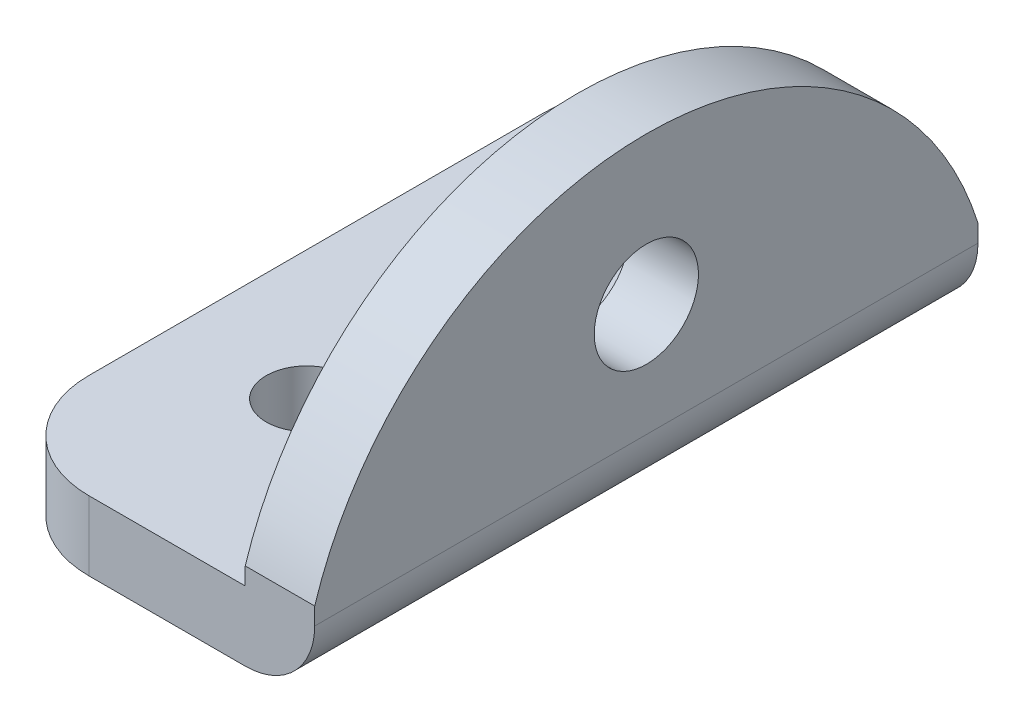
ISO-10303-21;
HEADER;
FILE_DESCRIPTION(('STEP AP214'),'2;1');
FILE_NAME('part.step','',(''),(''),'','','');
FILE_SCHEMA(('AUTOMOTIVE_DESIGN { 1 0 10303 214 1 1 1 1 }'));
ENDSEC;
DATA;
#1=APPLICATION_CONTEXT('core data for automotive mechanical design processes');
#2=APPLICATION_PROTOCOL_DEFINITION('international standard','automotive_design',2000,#1);
#3=PRODUCT_CONTEXT('',#1,'mechanical');
#4=PRODUCT('Part','Part','',(#3));
#5=PRODUCT_RELATED_PRODUCT_CATEGORY('part','',(#4));
#6=PRODUCT_DEFINITION_FORMATION('','',#4);
#7=PRODUCT_DEFINITION_CONTEXT('part definition',#1,'design');
#8=PRODUCT_DEFINITION('design','',#6,#7);
#9=PRODUCT_DEFINITION_SHAPE('','',#8);
#10=(LENGTH_UNIT() NAMED_UNIT(*) SI_UNIT(.MILLI.,.METRE.));
#11=(NAMED_UNIT(*) PLANE_ANGLE_UNIT() SI_UNIT($,.RADIAN.));
#12=(NAMED_UNIT(*) SI_UNIT($,.STERADIAN.) SOLID_ANGLE_UNIT());
#13=UNCERTAINTY_MEASURE_WITH_UNIT(LENGTH_MEASURE(1.E-05),#10,'distance_accuracy_value','');
#14=(GEOMETRIC_REPRESENTATION_CONTEXT(3) GLOBAL_UNCERTAINTY_ASSIGNED_CONTEXT((#13)) GLOBAL_UNIT_ASSIGNED_CONTEXT((#10,
#11,#12)) REPRESENTATION_CONTEXT('',''));
#15=CARTESIAN_POINT('',(0.,0.,0.));
#16=DIRECTION('',(0.,0.,1.));
#17=DIRECTION('',(1.,0.,0.));
#18=AXIS2_PLACEMENT_3D('',#15,#16,#17);
#19=CARTESIAN_POINT('',(-2.,0.,9.55));
#20=DIRECTION('',(1.,0.,0.));
#21=DIRECTION('',(0.,0.,-1.));
#22=AXIS2_PLACEMENT_3D('',#19,#20,#21);
#23=PLANE('',#22);
#24=CARTESIAN_POINT('',(-2.,5.25,0.));
#25=DIRECTION('',(-1.,0.,0.));
#26=DIRECTION('',(0.,0.,1.));
#27=AXIS2_PLACEMENT_3D('',#24,#25,#26);
#28=CIRCLE('',#27,1.49999999999999);
#29=CARTESIAN_POINT('',(-2.,5.25,1.49999999999999));
#30=VERTEX_POINT('',#29);
#31=EDGE_CURVE('E160',#30,#30,#28,.T.);
#32=ORIENTED_EDGE('',*,*,#31,.F.);
#33=EDGE_LOOP('',(#32));
#34=FACE_BOUND('',#33,.T.);
#35=DIRECTION('',(0.,0.,-1.));
#36=VECTOR('',#35,1.);
#37=CARTESIAN_POINT('',(-2.,2.,-9.55));
#38=LINE('',#37,#36);
#39=CARTESIAN_POINT('',(-2.,2.,9.55));
#40=VERTEX_POINT('',#39);
#41=CARTESIAN_POINT('',(-2.,2.,-9.55));
#42=VERTEX_POINT('',#41);
#43=EDGE_CURVE('E132',#40,#42,#38,.T.);
#44=ORIENTED_EDGE('',*,*,#43,.F.);
#45=DIRECTION('',(0.,1.,0.));
#46=VECTOR('',#45,1.);
#47=CARTESIAN_POINT('',(-2.,0.,9.55));
#48=LINE('',#47,#46);
#49=CARTESIAN_POINT('',(-2.,2.5,9.55));
#50=VERTEX_POINT('',#49);
#51=EDGE_CURVE('E452',#50,#40,#48,.F.);
#52=ORIENTED_EDGE('',*,*,#51,.F.);
#53=CARTESIAN_POINT('',(-2.,-0.514464285714287,0.));
#54=DIRECTION('',(1.,0.,0.));
#55=DIRECTION('',(0.,0.,-1.));
#56=AXIS2_PLACEMENT_3D('',#53,#54,#55);
#57=CIRCLE('',#56,10.0144642857143);
#58=CARTESIAN_POINT('',(-2.,2.5,-9.55));
#59=VERTEX_POINT('',#58);
#60=EDGE_CURVE('E134',#59,#50,#57,.T.);
#61=ORIENTED_EDGE('',*,*,#60,.F.);
#62=DIRECTION('',(0.,1.,0.));
#63=VECTOR('',#62,1.);
#64=CARTESIAN_POINT('',(-2.,0.,-9.55));
#65=LINE('',#64,#63);
#66=EDGE_CURVE('E121',#42,#59,#65,.T.);
#67=ORIENTED_EDGE('',*,*,#66,.F.);
#68=EDGE_LOOP('',(#44,#52,#61,#67));
#69=FACE_BOUND('',#68,.T.);
#70=ADVANCED_FACE('F46',(#34,#69),#23,.F.);
#71=CARTESIAN_POINT('',(-2.,2.,-9.55));
#72=DIRECTION('',(0.,0.,1.));
#73=DIRECTION('',(1.,0.,0.));
#74=AXIS2_PLACEMENT_3D('',#71,#72,#73);
#75=PLANE('',#74);
#76=DIRECTION('',(1.,0.,0.));
#77=VECTOR('',#76,1.);
#78=CARTESIAN_POINT('',(-9.5,0.,-9.55));
#79=LINE('',#78,#77);
#80=CARTESIAN_POINT('',(-6.5,0.,-9.55));
#81=VERTEX_POINT('',#80);
#82=CARTESIAN_POINT('',(-2.,0.,-9.55));
#83=VERTEX_POINT('',#82);
#84=EDGE_CURVE('E126',#81,#83,#79,.T.);
#85=ORIENTED_EDGE('',*,*,#84,.F.);
#86=DIRECTION('',(0.,-1.,0.));
#87=VECTOR('',#86,1.);
#88=CARTESIAN_POINT('',(-6.5,2.,-9.55));
#89=LINE('',#88,#87);
#90=CARTESIAN_POINT('',(-6.5,2.,-9.55));
#91=VERTEX_POINT('',#90);
#92=EDGE_CURVE('E72',#81,#91,#89,.F.);
#93=ORIENTED_EDGE('',*,*,#92,.T.);
#94=DIRECTION('',(1.,0.,0.));
#95=VECTOR('',#94,1.);
#96=CARTESIAN_POINT('',(-9.5,2.,-9.55));
#97=LINE('',#96,#95);
#98=EDGE_CURVE('E117',#91,#42,#97,.T.);
#99=ORIENTED_EDGE('',*,*,#98,.T.);
#100=ORIENTED_EDGE('',*,*,#66,.T.);
#101=DIRECTION('',(1.,0.,0.));
#102=VECTOR('',#101,1.);
#103=CARTESIAN_POINT('',(0.,2.5,-9.55));
#104=LINE('',#103,#102);
#105=CARTESIAN_POINT('',(0.,2.5,-9.55));
#106=VERTEX_POINT('',#105);
#107=EDGE_CURVE('E310',#106,#59,#104,.F.);
#108=ORIENTED_EDGE('',*,*,#107,.F.);
#109=DIRECTION('',(0.,1.,0.));
#110=VECTOR('',#109,1.);
#111=CARTESIAN_POINT('',(0.,2.,-9.55));
#112=LINE('',#111,#110);
#113=CARTESIAN_POINT('',(0.,2.,-9.55));
#114=VERTEX_POINT('',#113);
#115=EDGE_CURVE('E170',#106,#114,#112,.F.);
#116=ORIENTED_EDGE('',*,*,#115,.T.);
#117=CARTESIAN_POINT('',(-2.,2.,-9.55));
#118=DIRECTION('',(0.,0.,-1.));
#119=DIRECTION('',(-1.,0.,0.));
#120=AXIS2_PLACEMENT_3D('',#117,#118,#119);
#121=CIRCLE('',#120,2.);
#122=EDGE_CURVE('E274',#83,#114,#121,.F.);
#123=ORIENTED_EDGE('',*,*,#122,.F.);
#124=EDGE_LOOP('',(#85,#93,#99,#100,#108,#116,#123));
#125=FACE_BOUND('',#124,.T.);
#126=ADVANCED_FACE('F119',(#125),#75,.F.);
#127=CARTESIAN_POINT('',(-2.,2.,9.55));
#128=DIRECTION('',(0.,0.,1.));
#129=DIRECTION('',(1.,0.,0.));
#130=AXIS2_PLACEMENT_3D('',#127,#128,#129);
#131=PLANE('',#130);
#132=DIRECTION('',(1.,0.,0.));
#133=VECTOR('',#132,1.);
#134=CARTESIAN_POINT('',(-9.5,2.,9.55));
#135=LINE('',#134,#133);
#136=CARTESIAN_POINT('',(-6.5,2.,9.55));
#137=VERTEX_POINT('',#136);
#138=EDGE_CURVE('E125',#137,#40,#135,.T.);
#139=ORIENTED_EDGE('',*,*,#138,.F.);
#140=DIRECTION('',(0.,1.,0.));
#141=VECTOR('',#140,1.);
#142=CARTESIAN_POINT('',(-6.5,0.,9.55));
#143=LINE('',#142,#141);
#144=CARTESIAN_POINT('',(-6.5,0.,9.55));
#145=VERTEX_POINT('',#144);
#146=EDGE_CURVE('E12',#137,#145,#143,.F.);
#147=ORIENTED_EDGE('',*,*,#146,.T.);
#148=DIRECTION('',(1.,0.,0.));
#149=VECTOR('',#148,1.);
#150=CARTESIAN_POINT('',(-9.5,0.,9.55));
#151=LINE('',#150,#149);
#152=CARTESIAN_POINT('',(-2.,0.,9.55));
#153=VERTEX_POINT('',#152);
#154=EDGE_CURVE('E150',#145,#153,#151,.T.);
#155=ORIENTED_EDGE('',*,*,#154,.T.);
#156=CARTESIAN_POINT('',(-2.,2.,9.55));
#157=DIRECTION('',(0.,0.,-1.));
#158=DIRECTION('',(-1.,0.,0.));
#159=AXIS2_PLACEMENT_3D('',#156,#157,#158);
#160=CIRCLE('',#159,2.);
#161=CARTESIAN_POINT('',(0.,2.,9.55));
#162=VERTEX_POINT('',#161);
#163=EDGE_CURVE('E204',#162,#153,#160,.T.);
#164=ORIENTED_EDGE('',*,*,#163,.F.);
#165=DIRECTION('',(0.,1.,0.));
#166=VECTOR('',#165,1.);
#167=CARTESIAN_POINT('',(0.,0.,9.55));
#168=LINE('',#167,#166);
#169=CARTESIAN_POINT('',(0.,2.5,9.55));
#170=VERTEX_POINT('',#169);
#171=EDGE_CURVE('E281',#170,#162,#168,.F.);
#172=ORIENTED_EDGE('',*,*,#171,.F.);
#173=DIRECTION('',(1.,0.,0.));
#174=VECTOR('',#173,1.);
#175=CARTESIAN_POINT('',(-2.,2.5,9.55));
#176=LINE('',#175,#174);
#177=EDGE_CURVE('E136',#170,#50,#176,.F.);
#178=ORIENTED_EDGE('',*,*,#177,.T.);
#179=ORIENTED_EDGE('',*,*,#51,.T.);
#180=EDGE_LOOP('',(#139,#147,#155,#164,#172,#178,#179));
#181=FACE_BOUND('',#180,.T.);
#182=ADVANCED_FACE('F259',(#181),#131,.T.);
#183=CARTESIAN_POINT('',(0.,-0.514464285714287,0.));
#184=DIRECTION('',(1.,0.,0.));
#185=DIRECTION('',(0.,0.,-1.));
#186=AXIS2_PLACEMENT_3D('',#183,#184,#185);
#187=CYLINDRICAL_SURFACE('',#186,10.0144642857143);
#188=ORIENTED_EDGE('',*,*,#60,.T.);
#189=ORIENTED_EDGE('',*,*,#177,.F.);
#190=CARTESIAN_POINT('',(0.,-0.514464285714287,0.));
#191=DIRECTION('',(1.,0.,0.));
#192=DIRECTION('',(0.,0.,-1.));
#193=AXIS2_PLACEMENT_3D('',#190,#191,#192);
#194=CIRCLE('',#193,10.0144642857143);
#195=EDGE_CURVE('E441',#106,#170,#194,.T.);
#196=ORIENTED_EDGE('',*,*,#195,.F.);
#197=ORIENTED_EDGE('',*,*,#107,.T.);
#198=EDGE_LOOP('',(#188,#189,#196,#197));
#199=FACE_BOUND('',#198,.T.);
#200=ADVANCED_FACE('F265',(#199),#187,.T.);
#201=CARTESIAN_POINT('',(0.,0.,9.55));
#202=DIRECTION('',(1.,0.,0.));
#203=DIRECTION('',(0.,0.,-1.));
#204=AXIS2_PLACEMENT_3D('',#201,#202,#203);
#205=PLANE('',#204);
#206=CARTESIAN_POINT('',(0.,5.25,0.));
#207=DIRECTION('',(-1.,0.,0.));
#208=DIRECTION('',(0.,0.,1.));
#209=AXIS2_PLACEMENT_3D('',#206,#207,#208);
#210=CIRCLE('',#209,1.49999999999999);
#211=CARTESIAN_POINT('',(0.,5.25,1.49999999999999));
#212=VERTEX_POINT('',#211);
#213=EDGE_CURVE('E165',#212,#212,#210,.T.);
#214=ORIENTED_EDGE('',*,*,#213,.T.);
#215=EDGE_LOOP('',(#214));
#216=FACE_BOUND('',#215,.T.);
#217=DIRECTION('',(0.,0.,-1.));
#218=VECTOR('',#217,1.);
#219=CARTESIAN_POINT('',(0.,2.,9.55));
#220=LINE('',#219,#218);
#221=EDGE_CURVE('E280',#114,#162,#220,.F.);
#222=ORIENTED_EDGE('',*,*,#221,.F.);
#223=ORIENTED_EDGE('',*,*,#115,.F.);
#224=ORIENTED_EDGE('',*,*,#195,.T.);
#225=ORIENTED_EDGE('',*,*,#171,.T.);
#226=EDGE_LOOP('',(#222,#223,#224,#225));
#227=FACE_BOUND('',#226,.T.);
#228=ADVANCED_FACE('F264',(#216,#227),#205,.T.);
#229=CARTESIAN_POINT('',(-2.,2.,9.55));
#230=DIRECTION('',(0.,0.,-1.));
#231=DIRECTION('',(-1.,0.,0.));
#232=AXIS2_PLACEMENT_3D('',#229,#230,#231);
#233=CYLINDRICAL_SURFACE('',#232,2.);
#234=ORIENTED_EDGE('',*,*,#163,.T.);
#235=DIRECTION('',(0.,0.,1.));
#236=VECTOR('',#235,1.);
#237=CARTESIAN_POINT('',(-2.,0.,9.55));
#238=LINE('',#237,#236);
#239=EDGE_CURVE('E171',#83,#153,#238,.T.);
#240=ORIENTED_EDGE('',*,*,#239,.F.);
#241=ORIENTED_EDGE('',*,*,#122,.T.);
#242=ORIENTED_EDGE('',*,*,#221,.T.);
#243=EDGE_LOOP('',(#234,#240,#241,#242));
#244=FACE_BOUND('',#243,.T.);
#245=ADVANCED_FACE('F283',(#244),#233,.T.);
#246=CARTESIAN_POINT('',(-2.,5.25,0.));
#247=DIRECTION('',(-1.,0.,0.));
#248=DIRECTION('',(0.,0.,1.));
#249=AXIS2_PLACEMENT_3D('',#246,#247,#248);
#250=CYLINDRICAL_SURFACE('',#249,1.49999999999999);
#251=ORIENTED_EDGE('',*,*,#213,.F.);
#252=EDGE_LOOP('',(#251));
#253=FACE_BOUND('',#252,.T.);
#254=ORIENTED_EDGE('',*,*,#31,.T.);
#255=EDGE_LOOP('',(#254));
#256=FACE_BOUND('',#255,.T.);
#257=ADVANCED_FACE('F235',(#253,#256),#250,.F.);
#258=CARTESIAN_POINT('',(-9.5,2.,-9.55));
#259=DIRECTION('',(0.,-1.,0.));
#260=DIRECTION('',(0.,0.,-1.));
#261=AXIS2_PLACEMENT_3D('',#258,#259,#260);
#262=PLANE('',#261);
#263=CARTESIAN_POINT('',(-5.64622763317233,2.,-4.));
#264=DIRECTION('',(0.,1.,0.));
#265=DIRECTION('',(0.,0.,1.));
#266=AXIS2_PLACEMENT_3D('',#263,#264,#265);
#267=CIRCLE('',#266,1.08281359236262);
#268=CARTESIAN_POINT('',(-5.64622763317233,2.,-2.91718640763738));
#269=VERTEX_POINT('',#268);
#270=EDGE_CURVE('E215',#269,#269,#267,.T.);
#271=ORIENTED_EDGE('',*,*,#270,.F.);
#272=EDGE_LOOP('',(#271));
#273=FACE_BOUND('',#272,.T.);
#274=CARTESIAN_POINT('',(-5.78386655581007,2.,4.));
#275=DIRECTION('',(0.,1.,0.));
#276=DIRECTION('',(0.,0.,1.));
#277=AXIS2_PLACEMENT_3D('',#274,#275,#276);
#278=CIRCLE('',#277,1.16040407691515);
#279=CARTESIAN_POINT('',(-5.78386655581007,2.,5.16040407691515));
#280=VERTEX_POINT('',#279);
#281=EDGE_CURVE('E222',#280,#280,#278,.T.);
#282=ORIENTED_EDGE('',*,*,#281,.F.);
#283=EDGE_LOOP('',(#282));
#284=FACE_BOUND('',#283,.T.);
#285=ORIENTED_EDGE('',*,*,#98,.F.);
#286=CARTESIAN_POINT('',(-6.5,2.,-6.55));
#287=DIRECTION('',(0.,-1.,0.));
#288=DIRECTION('',(0.,0.,-1.));
#289=AXIS2_PLACEMENT_3D('',#286,#287,#288);
#290=CIRCLE('',#289,3.);
#291=CARTESIAN_POINT('',(-9.5,2.,-6.55));
#292=VERTEX_POINT('',#291);
#293=EDGE_CURVE('E56',#91,#292,#290,.F.);
#294=ORIENTED_EDGE('',*,*,#293,.T.);
#295=DIRECTION('',(0.,0.,-1.));
#296=VECTOR('',#295,1.);
#297=CARTESIAN_POINT('',(-9.5,2.,-9.55));
#298=LINE('',#297,#296);
#299=CARTESIAN_POINT('',(-9.5,2.,6.55));
#300=VERTEX_POINT('',#299);
#301=EDGE_CURVE('E139',#300,#292,#298,.T.);
#302=ORIENTED_EDGE('',*,*,#301,.F.);
#303=CARTESIAN_POINT('',(-6.5,2.,6.55));
#304=DIRECTION('',(0.,-1.,0.));
#305=DIRECTION('',(0.,0.,-1.));
#306=AXIS2_PLACEMENT_3D('',#303,#304,#305);
#307=CIRCLE('',#306,3.);
#308=EDGE_CURVE('E64',#300,#137,#307,.F.);
#309=ORIENTED_EDGE('',*,*,#308,.T.);
#310=ORIENTED_EDGE('',*,*,#138,.T.);
#311=ORIENTED_EDGE('',*,*,#43,.T.);
#312=EDGE_LOOP('',(#285,#294,#302,#309,#310,#311));
#313=FACE_BOUND('',#312,.T.);
#314=ADVANCED_FACE('F138',(#273,#284,#313),#262,.F.);
#315=CARTESIAN_POINT('',(-9.5,0.,9.55));
#316=DIRECTION('',(0.,1.,0.));
#317=DIRECTION('',(0.,0.,1.));
#318=AXIS2_PLACEMENT_3D('',#315,#316,#317);
#319=PLANE('',#318);
#320=CARTESIAN_POINT('',(-5.64622763317233,0.,-4.));
#321=DIRECTION('',(0.,1.,0.));
#322=DIRECTION('',(0.,0.,1.));
#323=AXIS2_PLACEMENT_3D('',#320,#321,#322);
#324=CIRCLE('',#323,1.08281359236262);
#325=CARTESIAN_POINT('',(-5.64622763317233,0.,-2.91718640763738));
#326=VERTEX_POINT('',#325);
#327=EDGE_CURVE('E50',#326,#326,#324,.T.);
#328=ORIENTED_EDGE('',*,*,#327,.T.);
#329=EDGE_LOOP('',(#328));
#330=FACE_BOUND('',#329,.T.);
#331=CARTESIAN_POINT('',(-5.78386655581007,0.,4.));
#332=DIRECTION('',(0.,1.,0.));
#333=DIRECTION('',(0.,0.,1.));
#334=AXIS2_PLACEMENT_3D('',#331,#332,#333);
#335=CIRCLE('',#334,1.16040407691515);
#336=CARTESIAN_POINT('',(-5.78386655581007,0.,5.16040407691515));
#337=VERTEX_POINT('',#336);
#338=EDGE_CURVE('E145',#337,#337,#335,.T.);
#339=ORIENTED_EDGE('',*,*,#338,.T.);
#340=EDGE_LOOP('',(#339));
#341=FACE_BOUND('',#340,.T.);
#342=DIRECTION('',(0.,0.,1.));
#343=VECTOR('',#342,1.);
#344=CARTESIAN_POINT('',(-9.5,0.,9.55));
#345=LINE('',#344,#343);
#346=CARTESIAN_POINT('',(-9.5,0.,-6.55));
#347=VERTEX_POINT('',#346);
#348=CARTESIAN_POINT('',(-9.5,0.,6.55));
#349=VERTEX_POINT('',#348);
#350=EDGE_CURVE('E142',#347,#349,#345,.T.);
#351=ORIENTED_EDGE('',*,*,#350,.F.);
#352=CARTESIAN_POINT('',(-6.5,0.,-6.55));
#353=DIRECTION('',(0.,1.,0.));
#354=DIRECTION('',(0.,0.,1.));
#355=AXIS2_PLACEMENT_3D('',#352,#353,#354);
#356=CIRCLE('',#355,3.);
#357=EDGE_CURVE('E209',#347,#81,#356,.F.);
#358=ORIENTED_EDGE('',*,*,#357,.T.);
#359=ORIENTED_EDGE('',*,*,#84,.T.);
#360=ORIENTED_EDGE('',*,*,#239,.T.);
#361=ORIENTED_EDGE('',*,*,#154,.F.);
#362=CARTESIAN_POINT('',(-6.5,0.,6.55));
#363=DIRECTION('',(0.,1.,0.));
#364=DIRECTION('',(0.,0.,1.));
#365=AXIS2_PLACEMENT_3D('',#362,#363,#364);
#366=CIRCLE('',#365,3.);
#367=EDGE_CURVE('E200',#145,#349,#366,.F.);
#368=ORIENTED_EDGE('',*,*,#367,.T.);
#369=EDGE_LOOP('',(#351,#358,#359,#360,#361,#368));
#370=FACE_BOUND('',#369,.T.);
#371=ADVANCED_FACE('F234',(#330,#341,#370),#319,.F.);
#372=CARTESIAN_POINT('',(-9.5,0.,0.));
#373=DIRECTION('',(1.,0.,0.));
#374=DIRECTION('',(0.,0.,-1.));
#375=AXIS2_PLACEMENT_3D('',#372,#373,#374);
#376=PLANE('',#375);
#377=ORIENTED_EDGE('',*,*,#301,.T.);
#378=DIRECTION('',(0.,-1.,0.));
#379=VECTOR('',#378,1.);
#380=CARTESIAN_POINT('',(-9.5,0.,-6.55));
#381=LINE('',#380,#379);
#382=EDGE_CURVE('E196',#292,#347,#381,.T.);
#383=ORIENTED_EDGE('',*,*,#382,.T.);
#384=ORIENTED_EDGE('',*,*,#350,.T.);
#385=DIRECTION('',(0.,1.,0.));
#386=VECTOR('',#385,1.);
#387=CARTESIAN_POINT('',(-9.5,2.,6.55));
#388=LINE('',#387,#386);
#389=EDGE_CURVE('E194',#349,#300,#388,.T.);
#390=ORIENTED_EDGE('',*,*,#389,.T.);
#391=EDGE_LOOP('',(#377,#383,#384,#390));
#392=FACE_BOUND('',#391,.T.);
#393=ADVANCED_FACE('F193',(#392),#376,.F.);
#394=CARTESIAN_POINT('',(-6.5,0.,-6.55));
#395=DIRECTION('',(0.,-1.,0.));
#396=DIRECTION('',(0.,0.,-1.));
#397=AXIS2_PLACEMENT_3D('',#394,#395,#396);
#398=CYLINDRICAL_SURFACE('',#397,3.);
#399=ORIENTED_EDGE('',*,*,#293,.F.);
#400=ORIENTED_EDGE('',*,*,#92,.F.);
#401=ORIENTED_EDGE('',*,*,#357,.F.);
#402=ORIENTED_EDGE('',*,*,#382,.F.);
#403=EDGE_LOOP('',(#399,#400,#401,#402));
#404=FACE_BOUND('',#403,.T.);
#405=ADVANCED_FACE('F251',(#404),#398,.T.);
#406=CARTESIAN_POINT('',(-6.5,0.,6.55));
#407=DIRECTION('',(0.,-1.,0.));
#408=DIRECTION('',(0.,0.,-1.));
#409=AXIS2_PLACEMENT_3D('',#406,#407,#408);
#410=CYLINDRICAL_SURFACE('',#409,3.);
#411=ORIENTED_EDGE('',*,*,#367,.F.);
#412=ORIENTED_EDGE('',*,*,#146,.F.);
#413=ORIENTED_EDGE('',*,*,#308,.F.);
#414=ORIENTED_EDGE('',*,*,#389,.F.);
#415=EDGE_LOOP('',(#411,#412,#413,#414));
#416=FACE_BOUND('',#415,.T.);
#417=ADVANCED_FACE('F48',(#416),#410,.T.);
#418=CARTESIAN_POINT('',(-5.78386655581007,-8.,4.));
#419=DIRECTION('',(0.,1.,0.));
#420=DIRECTION('',(0.,0.,1.));
#421=AXIS2_PLACEMENT_3D('',#418,#419,#420);
#422=CYLINDRICAL_SURFACE('',#421,1.16040407691515);
#423=ORIENTED_EDGE('',*,*,#281,.T.);
#424=EDGE_LOOP('',(#423));
#425=FACE_BOUND('',#424,.T.);
#426=ORIENTED_EDGE('',*,*,#338,.F.);
#427=EDGE_LOOP('',(#426));
#428=FACE_BOUND('',#427,.T.);
#429=ADVANCED_FACE('F239',(#425,#428),#422,.F.);
#430=CARTESIAN_POINT('',(-5.64622763317233,-8.,-4.));
#431=DIRECTION('',(0.,1.,0.));
#432=DIRECTION('',(0.,0.,1.));
#433=AXIS2_PLACEMENT_3D('',#430,#431,#432);
#434=CYLINDRICAL_SURFACE('',#433,1.08281359236262);
#435=ORIENTED_EDGE('',*,*,#270,.T.);
#436=EDGE_LOOP('',(#435));
#437=FACE_BOUND('',#436,.T.);
#438=ORIENTED_EDGE('',*,*,#327,.F.);
#439=EDGE_LOOP('',(#438));
#440=FACE_BOUND('',#439,.T.);
#441=ADVANCED_FACE('F229',(#437,#440),#434,.F.);
#442=CLOSED_SHELL('',(#70,#126,#182,#200,#228,#245,#257,#314,#371,#393,#405,#417,#429,#441));
#443=MANIFOLD_SOLID_BREP('B2',#442);
#444=ADVANCED_BREP_SHAPE_REPRESENTATION('',(#18,#443),#14);
#445=SHAPE_DEFINITION_REPRESENTATION(#9,#444);
ENDSEC;
END-ISO-10303-21;
